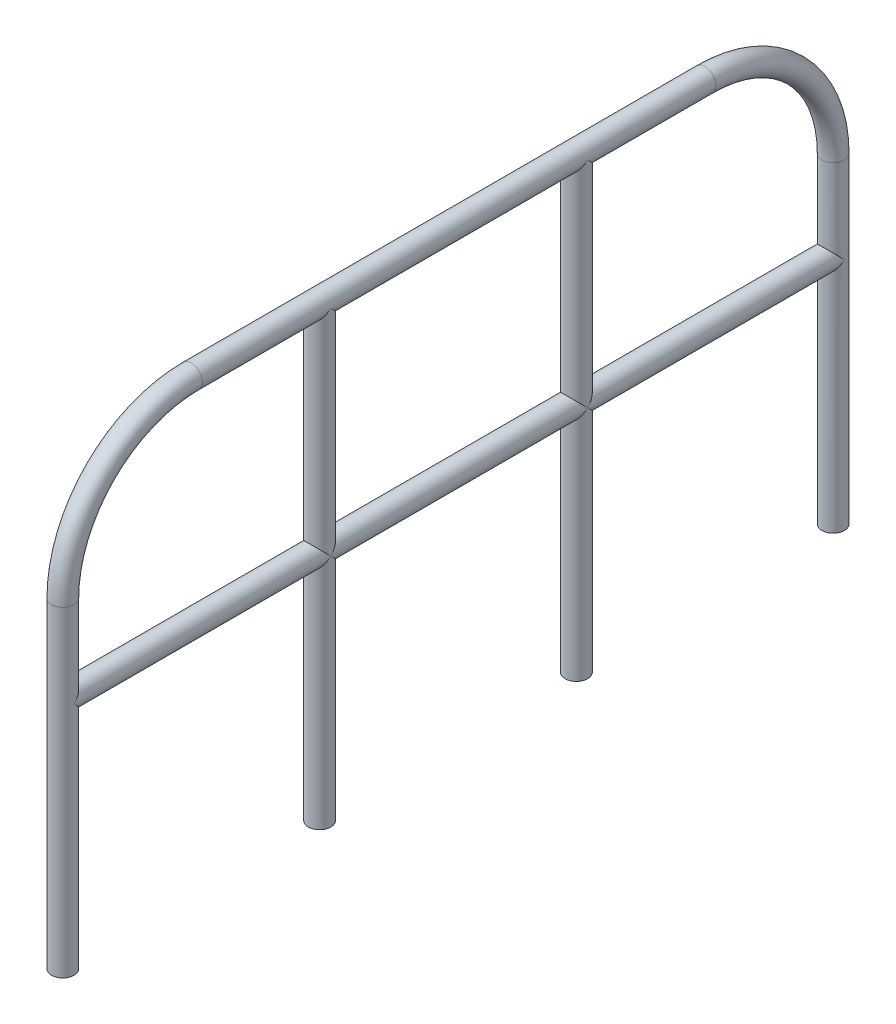
ISO-10303-21;
HEADER;
FILE_DESCRIPTION(('STEP AP214'),'2;1');
FILE_NAME('part.step','',(''),(''),'','','');
FILE_SCHEMA(('AUTOMOTIVE_DESIGN { 1 0 10303 214 1 1 1 1 }'));
ENDSEC;
DATA;
#1=APPLICATION_CONTEXT('core data for automotive mechanical design processes');
#2=APPLICATION_PROTOCOL_DEFINITION('international standard','automotive_design',2000,#1);
#3=PRODUCT_CONTEXT('',#1,'mechanical');
#4=PRODUCT('Part','Part','',(#3));
#5=PRODUCT_RELATED_PRODUCT_CATEGORY('part','',(#4));
#6=PRODUCT_DEFINITION_FORMATION('','',#4);
#7=PRODUCT_DEFINITION_CONTEXT('part definition',#1,'design');
#8=PRODUCT_DEFINITION('design','',#6,#7);
#9=PRODUCT_DEFINITION_SHAPE('','',#8);
#10=(LENGTH_UNIT() NAMED_UNIT(*) SI_UNIT(.MILLI.,.METRE.));
#11=(NAMED_UNIT(*) PLANE_ANGLE_UNIT() SI_UNIT($,.RADIAN.));
#12=(NAMED_UNIT(*) SI_UNIT($,.STERADIAN.) SOLID_ANGLE_UNIT());
#13=UNCERTAINTY_MEASURE_WITH_UNIT(LENGTH_MEASURE(1.E-05),#10,'distance_accuracy_value','');
#14=(GEOMETRIC_REPRESENTATION_CONTEXT(3) GLOBAL_UNCERTAINTY_ASSIGNED_CONTEXT((#13)) GLOBAL_UNIT_ASSIGNED_CONTEXT((#10,
#11,#12)) REPRESENTATION_CONTEXT('',''));
#15=CARTESIAN_POINT('',(0.,0.,0.));
#16=DIRECTION('',(0.,0.,1.));
#17=DIRECTION('',(1.,0.,0.));
#18=AXIS2_PLACEMENT_3D('',#15,#16,#17);
#19=CARTESIAN_POINT('',(-35.,10.,0.));
#20=DIRECTION('',(1.,0.,0.));
#21=DIRECTION('',(0.,0.,-1.));
#22=AXIS2_PLACEMENT_3D('',#19,#20,#21);
#23=PLANE('',#22);
#24=DIRECTION('',(0.,0.,1.));
#25=VECTOR('',#24,1.);
#26=CARTESIAN_POINT('',(-35.,0.,0.));
#27=LINE('',#26,#25);
#28=CARTESIAN_POINT('',(-35.,0.,-21.5581299689021));
#29=VERTEX_POINT('',#28);
#30=CARTESIAN_POINT('',(-35.,0.,0.));
#31=VERTEX_POINT('',#30);
#32=EDGE_CURVE('E107',#29,#31,#27,.T.);
#33=ORIENTED_EDGE('',*,*,#32,.F.);
#34=DIRECTION('',(0.,-1.,0.));
#35=VECTOR('',#34,1.);
#36=CARTESIAN_POINT('',(-35.,10.,-21.5581299689021));
#37=LINE('',#36,#35);
#38=CARTESIAN_POINT('',(-35.,10.,-21.5581299689021));
#39=VERTEX_POINT('',#38);
#40=EDGE_CURVE('E12',#39,#29,#37,.T.);
#41=ORIENTED_EDGE('',*,*,#40,.F.);
#42=DIRECTION('',(0.,0.,1.));
#43=VECTOR('',#42,1.);
#44=CARTESIAN_POINT('',(-35.,10.,0.));
#45=LINE('',#44,#43);
#46=CARTESIAN_POINT('',(-35.,10.,0.));
#47=VERTEX_POINT('',#46);
#48=EDGE_CURVE('E101',#39,#47,#45,.T.);
#49=ORIENTED_EDGE('',*,*,#48,.T.);
#50=DIRECTION('',(0.,-1.,0.));
#51=VECTOR('',#50,1.);
#52=CARTESIAN_POINT('',(-35.,10.,0.));
#53=LINE('',#52,#51);
#54=EDGE_CURVE('E46',#47,#31,#53,.T.);
#55=ORIENTED_EDGE('',*,*,#54,.T.);
#56=EDGE_LOOP('',(#33,#41,#49,#55));
#57=FACE_BOUND('',#56,.T.);
#58=ADVANCED_FACE('F43',(#57),#23,.T.);
#59=CARTESIAN_POINT('',(-35.,10.,-21.5581299689021));
#60=DIRECTION('',(0.,0.,-1.));
#61=DIRECTION('',(-1.,0.,0.));
#62=AXIS2_PLACEMENT_3D('',#59,#60,#61);
#63=PLANE('',#62);
#64=DIRECTION('',(1.,0.,0.));
#65=VECTOR('',#64,1.);
#66=CARTESIAN_POINT('',(-35.,0.,-21.5581299689021));
#67=LINE('',#66,#65);
#68=CARTESIAN_POINT('',(-43.2434008372538,0.,-21.5581299689021));
#69=VERTEX_POINT('',#68);
#70=EDGE_CURVE('E103',#69,#29,#67,.T.);
#71=ORIENTED_EDGE('',*,*,#70,.F.);
#72=DIRECTION('',(0.,-1.,0.));
#73=VECTOR('',#72,1.);
#74=CARTESIAN_POINT('',(-43.2434008372538,10.,-21.5581299689021));
#75=LINE('',#74,#73);
#76=CARTESIAN_POINT('',(-43.2434008372538,10.,-21.5581299689021));
#77=VERTEX_POINT('',#76);
#78=EDGE_CURVE('E52',#77,#69,#75,.T.);
#79=ORIENTED_EDGE('',*,*,#78,.F.);
#80=DIRECTION('',(1.,0.,0.));
#81=VECTOR('',#80,1.);
#82=CARTESIAN_POINT('',(-35.,10.,-21.5581299689021));
#83=LINE('',#82,#81);
#84=EDGE_CURVE('E98',#77,#39,#83,.T.);
#85=ORIENTED_EDGE('',*,*,#84,.T.);
#86=ORIENTED_EDGE('',*,*,#40,.T.);
#87=EDGE_LOOP('',(#71,#79,#85,#86));
#88=FACE_BOUND('',#87,.T.);
#89=ADVANCED_FACE('F117',(#88),#63,.T.);
#90=CARTESIAN_POINT('',(-43.2434008372538,10.,0.));
#91=DIRECTION('',(-1.,0.,0.));
#92=DIRECTION('',(0.,0.,1.));
#93=AXIS2_PLACEMENT_3D('',#90,#91,#92);
#94=PLANE('',#93);
#95=DIRECTION('',(0.,0.,-1.));
#96=VECTOR('',#95,1.);
#97=CARTESIAN_POINT('',(-43.2434008372538,0.,0.));
#98=LINE('',#97,#96);
#99=CARTESIAN_POINT('',(-43.2434008372538,0.,0.));
#100=VERTEX_POINT('',#99);
#101=EDGE_CURVE('E93',#100,#69,#98,.T.);
#102=ORIENTED_EDGE('',*,*,#101,.F.);
#103=DIRECTION('',(0.,-1.,0.));
#104=VECTOR('',#103,1.);
#105=CARTESIAN_POINT('',(-43.2434008372538,10.,0.));
#106=LINE('',#105,#104);
#107=CARTESIAN_POINT('',(-43.2434008372538,10.,0.));
#108=VERTEX_POINT('',#107);
#109=EDGE_CURVE('E88',#108,#100,#106,.T.);
#110=ORIENTED_EDGE('',*,*,#109,.F.);
#111=DIRECTION('',(0.,0.,-1.));
#112=VECTOR('',#111,1.);
#113=CARTESIAN_POINT('',(-43.2434008372538,10.,0.));
#114=LINE('',#113,#112);
#115=EDGE_CURVE('E91',#108,#77,#114,.T.);
#116=ORIENTED_EDGE('',*,*,#115,.T.);
#117=ORIENTED_EDGE('',*,*,#78,.T.);
#118=EDGE_LOOP('',(#102,#110,#116,#117));
#119=FACE_BOUND('',#118,.T.);
#120=ADVANCED_FACE('F90',(#119),#94,.T.);
#121=CARTESIAN_POINT('',(-35.,10.,0.));
#122=DIRECTION('',(0.,0.,1.));
#123=DIRECTION('',(1.,0.,0.));
#124=AXIS2_PLACEMENT_3D('',#121,#122,#123);
#125=PLANE('',#124);
#126=DIRECTION('',(-1.,0.,0.));
#127=VECTOR('',#126,1.);
#128=CARTESIAN_POINT('',(-35.,0.,0.));
#129=LINE('',#128,#127);
#130=EDGE_CURVE('E110',#31,#100,#129,.T.);
#131=ORIENTED_EDGE('',*,*,#130,.F.);
#132=ORIENTED_EDGE('',*,*,#54,.F.);
#133=DIRECTION('',(-1.,0.,0.));
#134=VECTOR('',#133,1.);
#135=CARTESIAN_POINT('',(-35.,10.,0.));
#136=LINE('',#135,#134);
#137=EDGE_CURVE('E97',#47,#108,#136,.T.);
#138=ORIENTED_EDGE('',*,*,#137,.T.);
#139=ORIENTED_EDGE('',*,*,#109,.T.);
#140=EDGE_LOOP('',(#131,#132,#138,#139));
#141=FACE_BOUND('',#140,.T.);
#142=ADVANCED_FACE('F100',(#141),#125,.T.);
#143=CARTESIAN_POINT('',(0.,10.,0.));
#144=DIRECTION('',(0.,1.,0.));
#145=DIRECTION('',(0.,0.,1.));
#146=AXIS2_PLACEMENT_3D('',#143,#144,#145);
#147=PLANE('',#146);
#148=ORIENTED_EDGE('',*,*,#48,.F.);
#149=ORIENTED_EDGE('',*,*,#84,.F.);
#150=ORIENTED_EDGE('',*,*,#115,.F.);
#151=ORIENTED_EDGE('',*,*,#137,.F.);
#152=EDGE_LOOP('',(#148,#149,#150,#151));
#153=FACE_BOUND('',#152,.T.);
#154=ADVANCED_FACE('F96',(#153),#147,.T.);
#155=CARTESIAN_POINT('',(0.,0.,0.));
#156=DIRECTION('',(0.,1.,0.));
#157=DIRECTION('',(0.,0.,1.));
#158=AXIS2_PLACEMENT_3D('',#155,#156,#157);
#159=PLANE('',#158);
#160=ORIENTED_EDGE('',*,*,#32,.T.);
#161=ORIENTED_EDGE('',*,*,#130,.T.);
#162=ORIENTED_EDGE('',*,*,#101,.T.);
#163=ORIENTED_EDGE('',*,*,#70,.T.);
#164=EDGE_LOOP('',(#160,#161,#162,#163));
#165=FACE_BOUND('',#164,.T.);
#166=ADVANCED_FACE('F116',(#165),#159,.F.);
#167=CLOSED_SHELL('',(#58,#89,#120,#142,#154,#166));
#168=MANIFOLD_SOLID_BREP('B2',#167);
#169=CARTESIAN_POINT('',(0.,1400.,-1600.));
#170=DIRECTION('',(0.,-1.,0.));
#171=DIRECTION('',(0.,0.,-1.));
#172=AXIS2_PLACEMENT_3D('',#169,#170,#171);
#173=CYLINDRICAL_SURFACE('',#172,35.);
#174=CARTESIAN_POINT('',(0.,1400.,-1600.));
#175=DIRECTION('',(0.,-0.707106781186547,-0.707106781186547));
#176=DIRECTION('',(0.,0.707106781186547,-0.707106781186547));
#177=AXIS2_PLACEMENT_3D('',#174,#175,#176);
#178=ELLIPSE('',#177,49.4974746830583,35.);
#179=CARTESIAN_POINT('',(-35.,1400.,-1600.));
#180=VERTEX_POINT('',#179);
#181=CARTESIAN_POINT('',(35.,1400.,-1600.));
#182=VERTEX_POINT('',#181);
#183=EDGE_CURVE('E262',#180,#182,#178,.F.);
#184=ORIENTED_EDGE('',*,*,#183,.F.);
#185=CARTESIAN_POINT('',(0.,1400.,-1600.));
#186=DIRECTION('',(0.,0.707106781186547,-0.707106781186547));
#187=DIRECTION('',(0.,-0.707106781186547,-0.707106781186547));
#188=AXIS2_PLACEMENT_3D('',#185,#186,#187);
#189=ELLIPSE('',#188,49.4974746830583,35.);
#190=EDGE_CURVE('E259',#182,#180,#189,.T.);
#191=ORIENTED_EDGE('',*,*,#190,.F.);
#192=EDGE_LOOP('',(#184,#191));
#193=FACE_BOUND('',#192,.T.);
#194=CARTESIAN_POINT('',(0.,731.105097609489,-1600.));
#195=DIRECTION('',(0.,-0.707106781186547,-0.707106781186547));
#196=DIRECTION('',(0.,-0.707106781186547,0.707106781186547));
#197=AXIS2_PLACEMENT_3D('',#194,#195,#196);
#198=ELLIPSE('',#197,49.4974746830583,35.);
#199=CARTESIAN_POINT('',(35.,731.105097609489,-1600.));
#200=VERTEX_POINT('',#199);
#201=CARTESIAN_POINT('',(-35.,731.105097609489,-1600.));
#202=VERTEX_POINT('',#201);
#203=EDGE_CURVE('E181',#200,#202,#198,.F.);
#204=ORIENTED_EDGE('',*,*,#203,.T.);
#205=CARTESIAN_POINT('',(0.,731.105097609489,-1600.));
#206=DIRECTION('',(0.,-0.707106781186547,0.707106781186547));
#207=DIRECTION('',(0.,-0.707106781186547,-0.707106781186547));
#208=AXIS2_PLACEMENT_3D('',#205,#206,#207);
#209=ELLIPSE('',#208,49.4974746830583,35.);
#210=EDGE_CURVE('E441',#202,#200,#209,.F.);
#211=ORIENTED_EDGE('',*,*,#210,.T.);
#212=EDGE_LOOP('',(#204,#211));
#213=FACE_BOUND('',#212,.T.);
#214=ADVANCED_FACE('F167',(#193,#213),#173,.T.);
#215=CARTESIAN_POINT('',(0.,1400.,-800.));
#216=DIRECTION('',(0.,-1.,0.));
#217=DIRECTION('',(0.,0.,-1.));
#218=AXIS2_PLACEMENT_3D('',#215,#216,#217);
#219=CYLINDRICAL_SURFACE('',#218,35.);
#220=CARTESIAN_POINT('',(0.,1400.,-800.));
#221=DIRECTION('',(0.,-0.707106781186547,-0.707106781186547));
#222=DIRECTION('',(0.,0.707106781186547,-0.707106781186547));
#223=AXIS2_PLACEMENT_3D('',#220,#221,#222);
#224=ELLIPSE('',#223,49.4974746830583,35.);
#225=CARTESIAN_POINT('',(-35.,1400.,-800.));
#226=VERTEX_POINT('',#225);
#227=CARTESIAN_POINT('',(35.,1400.,-800.));
#228=VERTEX_POINT('',#227);
#229=EDGE_CURVE('E268',#226,#228,#224,.F.);
#230=ORIENTED_EDGE('',*,*,#229,.F.);
#231=CARTESIAN_POINT('',(0.,1400.,-800.));
#232=DIRECTION('',(0.,0.707106781186547,-0.707106781186547));
#233=DIRECTION('',(0.,-0.707106781186547,-0.707106781186547));
#234=AXIS2_PLACEMENT_3D('',#231,#232,#233);
#235=ELLIPSE('',#234,49.4974746830583,35.);
#236=EDGE_CURVE('E265',#228,#226,#235,.T.);
#237=ORIENTED_EDGE('',*,*,#236,.F.);
#238=EDGE_LOOP('',(#230,#237));
#239=FACE_BOUND('',#238,.T.);
#240=CARTESIAN_POINT('',(0.,731.105097609489,-800.));
#241=DIRECTION('',(0.,-0.707106781186547,-0.707106781186547));
#242=DIRECTION('',(0.,-0.707106781186547,0.707106781186547));
#243=AXIS2_PLACEMENT_3D('',#240,#241,#242);
#244=ELLIPSE('',#243,49.4974746830583,35.);
#245=CARTESIAN_POINT('',(35.,731.105097609489,-800.));
#246=VERTEX_POINT('',#245);
#247=CARTESIAN_POINT('',(-35.,731.105097609489,-800.));
#248=VERTEX_POINT('',#247);
#249=EDGE_CURVE('E187',#246,#248,#244,.F.);
#250=ORIENTED_EDGE('',*,*,#249,.T.);
#251=CARTESIAN_POINT('',(0.,731.105097609489,-800.));
#252=DIRECTION('',(0.,-0.707106781186547,0.707106781186547));
#253=DIRECTION('',(0.,-0.707106781186547,-0.707106781186547));
#254=AXIS2_PLACEMENT_3D('',#251,#252,#253);
#255=ELLIPSE('',#254,49.4974746830583,35.);
#256=EDGE_CURVE('E41',#248,#246,#255,.F.);
#257=ORIENTED_EDGE('',*,*,#256,.T.);
#258=EDGE_LOOP('',(#250,#257));
#259=FACE_BOUND('',#258,.T.);
#260=ADVANCED_FACE('F285',(#239,#259),#219,.T.);
#261=CARTESIAN_POINT('',(0.,1400.,-400.000000000003));
#262=DIRECTION('',(0.,0.,-1.));
#263=DIRECTION('',(-1.,0.,0.));
#264=AXIS2_PLACEMENT_3D('',#261,#262,#263);
#265=CYLINDRICAL_SURFACE('',#264,35.);
#266=ORIENTED_EDGE('',*,*,#190,.T.);
#267=ORIENTED_EDGE('',*,*,#183,.T.);
#268=EDGE_LOOP('',(#266,#267));
#269=FACE_BOUND('',#268,.T.);
#270=CARTESIAN_POINT('',(0.,1400.,-400.000000000003));
#271=DIRECTION('',(0.,0.,-1.));
#272=DIRECTION('',(0.,1.,0.));
#273=AXIS2_PLACEMENT_3D('',#270,#271,#272);
#274=CIRCLE('',#273,35.);
#275=CARTESIAN_POINT('',(0.,1435.,-400.000000000003));
#276=VERTEX_POINT('',#275);
#277=EDGE_CURVE('E245',#276,#276,#274,.T.);
#278=ORIENTED_EDGE('',*,*,#277,.T.);
#279=EDGE_LOOP('',(#278));
#280=FACE_BOUND('',#279,.T.);
#281=CARTESIAN_POINT('',(0.,1400.,-2000.));
#282=DIRECTION('',(0.,0.,-1.));
#283=DIRECTION('',(0.,1.,0.));
#284=AXIS2_PLACEMENT_3D('',#281,#282,#283);
#285=CIRCLE('',#284,35.);
#286=CARTESIAN_POINT('',(0.,1435.,-2000.));
#287=VERTEX_POINT('',#286);
#288=EDGE_CURVE('E250',#287,#287,#285,.T.);
#289=ORIENTED_EDGE('',*,*,#288,.F.);
#290=EDGE_LOOP('',(#289));
#291=FACE_BOUND('',#290,.T.);
#292=ORIENTED_EDGE('',*,*,#236,.T.);
#293=ORIENTED_EDGE('',*,*,#229,.T.);
#294=EDGE_LOOP('',(#292,#293));
#295=FACE_BOUND('',#294,.T.);
#296=ADVANCED_FACE('F287',(#269,#280,#291,#295),#265,.T.);
#297=CARTESIAN_POINT('',(0.,999.999999999997,-2400.));
#298=DIRECTION('',(0.,-1.,0.));
#299=DIRECTION('',(0.,0.,-1.));
#300=AXIS2_PLACEMENT_3D('',#297,#298,#299);
#301=CYLINDRICAL_SURFACE('',#300,35.);
#302=CARTESIAN_POINT('',(0.,731.105097609489,-2400.));
#303=DIRECTION('',(0.,-0.707106781186547,0.707106781186547));
#304=DIRECTION('',(0.,-0.707106781186547,-0.707106781186547));
#305=AXIS2_PLACEMENT_3D('',#302,#303,#304);
#306=ELLIPSE('',#305,49.4974746830583,35.);
#307=CARTESIAN_POINT('',(35.,731.105097609489,-2400.));
#308=VERTEX_POINT('',#307);
#309=CARTESIAN_POINT('',(-35.,731.105097609489,-2400.));
#310=VERTEX_POINT('',#309);
#311=EDGE_CURVE('E220',#308,#310,#306,.T.);
#312=ORIENTED_EDGE('',*,*,#311,.F.);
#313=CARTESIAN_POINT('',(0.,731.105097609489,-2400.));
#314=DIRECTION('',(0.,-0.707106781186547,-0.707106781186547));
#315=DIRECTION('',(0.,-0.707106781186547,0.707106781186547));
#316=AXIS2_PLACEMENT_3D('',#313,#314,#315);
#317=ELLIPSE('',#316,49.4974746830583,35.);
#318=EDGE_CURVE('E223',#310,#308,#317,.F.);
#319=ORIENTED_EDGE('',*,*,#318,.F.);
#320=EDGE_LOOP('',(#312,#319));
#321=FACE_BOUND('',#320,.T.);
#322=CARTESIAN_POINT('',(0.,999.999999999997,-2400.));
#323=DIRECTION('',(0.,-1.,0.));
#324=DIRECTION('',(0.,0.,-1.));
#325=AXIS2_PLACEMENT_3D('',#322,#323,#324);
#326=CIRCLE('',#325,35.);
#327=CARTESIAN_POINT('',(0.,999.999999999997,-2435.));
#328=VERTEX_POINT('',#327);
#329=EDGE_CURVE('E253',#328,#328,#326,.T.);
#330=ORIENTED_EDGE('',*,*,#329,.T.);
#331=EDGE_LOOP('',(#330));
#332=FACE_BOUND('',#331,.T.);
#333=CARTESIAN_POINT('',(0.,-1.11022302462516E-13,-2400.));
#334=DIRECTION('',(0.,-1.,0.));
#335=DIRECTION('',(0.,0.,-1.));
#336=AXIS2_PLACEMENT_3D('',#333,#334,#335);
#337=CIRCLE('',#336,35.);
#338=CARTESIAN_POINT('',(0.,-1.10149586872964E-12,-2435.));
#339=VERTEX_POINT('',#338);
#340=EDGE_CURVE('E256',#339,#339,#337,.T.);
#341=ORIENTED_EDGE('',*,*,#340,.F.);
#342=EDGE_LOOP('',(#341));
#343=FACE_BOUND('',#342,.T.);
#344=ADVANCED_FACE('F169',(#321,#332,#343),#301,.T.);
#345=CARTESIAN_POINT('',(0.,1000.,-2000.));
#346=DIRECTION('',(-1.,0.,0.));
#347=DIRECTION('',(0.,0.,1.));
#348=AXIS2_PLACEMENT_3D('',#345,#346,#347);
#349=TOROIDAL_SURFACE('',#348,400.,35.);
#350=CARTESIAN_POINT('',(0.,1000.,-2000.));
#351=DIRECTION('',(-1.,0.,0.));
#352=DIRECTION('',(0.,0.,1.));
#353=AXIS2_PLACEMENT_3D('',#350,#351,#352);
#354=CIRCLE('',#353,435.);
#355=EDGE_CURVE('',#287,#328,#354,.T.);
#356=ORIENTED_EDGE('',*,*,#288,.T.);
#357=ORIENTED_EDGE('',*,*,#329,.F.);
#358=ORIENTED_EDGE('',*,*,#355,.T.);
#359=ORIENTED_EDGE('',*,*,#355,.F.);
#360=EDGE_LOOP('',(#356,#358,#357,#359));
#361=FACE_BOUND('',#360,.T.);
#362=ADVANCED_FACE('F341',(#361),#349,.T.);
#363=CARTESIAN_POINT('',(0.,1000.,-400.));
#364=DIRECTION('',(-1.,0.,0.));
#365=DIRECTION('',(0.,0.,1.));
#366=AXIS2_PLACEMENT_3D('',#363,#364,#365);
#367=TOROIDAL_SURFACE('',#366,400.,35.);
#368=CARTESIAN_POINT('',(0.,999.999999999997,0.));
#369=DIRECTION('',(0.,1.,0.));
#370=DIRECTION('',(0.,0.,1.));
#371=AXIS2_PLACEMENT_3D('',#368,#369,#370);
#372=CIRCLE('',#371,35.);
#373=CARTESIAN_POINT('',(0.,999.999999999997,35.));
#374=VERTEX_POINT('',#373);
#375=EDGE_CURVE('E242',#374,#374,#372,.T.);
#376=CARTESIAN_POINT('',(0.,1000.,-400.));
#377=DIRECTION('',(-1.,0.,0.));
#378=DIRECTION('',(0.,0.,1.));
#379=AXIS2_PLACEMENT_3D('',#376,#377,#378);
#380=CIRCLE('',#379,435.);
#381=EDGE_CURVE('',#374,#276,#380,.T.);
#382=ORIENTED_EDGE('',*,*,#375,.T.);
#383=ORIENTED_EDGE('',*,*,#277,.F.);
#384=ORIENTED_EDGE('',*,*,#381,.T.);
#385=ORIENTED_EDGE('',*,*,#381,.F.);
#386=EDGE_LOOP('',(#382,#384,#383,#385));
#387=FACE_BOUND('',#386,.T.);
#388=ADVANCED_FACE('F338',(#387),#367,.T.);
#389=CARTESIAN_POINT('',(0.,999.999999999997,0.));
#390=DIRECTION('',(0.,-1.,0.));
#391=DIRECTION('',(0.,0.,-1.));
#392=AXIS2_PLACEMENT_3D('',#389,#390,#391);
#393=CYLINDRICAL_SURFACE('',#392,35.);
#394=CARTESIAN_POINT('',(0.,0.,0.));
#395=DIRECTION('',(0.,1.,0.));
#396=DIRECTION('',(0.,0.,1.));
#397=AXIS2_PLACEMENT_3D('',#394,#395,#396);
#398=CIRCLE('',#397,35.);
#399=CARTESIAN_POINT('',(0.,0.,35.));
#400=VERTEX_POINT('',#399);
#401=EDGE_CURVE('E241',#400,#400,#398,.T.);
#402=ORIENTED_EDGE('',*,*,#401,.T.);
#403=EDGE_LOOP('',(#402));
#404=FACE_BOUND('',#403,.T.);
#405=CARTESIAN_POINT('',(0.,731.105097609489,0.));
#406=DIRECTION('',(0.,-0.707106781186547,-0.707106781186547));
#407=DIRECTION('',(0.,-0.707106781186547,0.707106781186547));
#408=AXIS2_PLACEMENT_3D('',#405,#406,#407);
#409=ELLIPSE('',#408,49.4974746830583,35.);
#410=CARTESIAN_POINT('',(35.,731.105097609489,0.));
#411=VERTEX_POINT('',#410);
#412=CARTESIAN_POINT('',(-35.,731.105097609489,0.));
#413=VERTEX_POINT('',#412);
#414=EDGE_CURVE('E232',#411,#413,#409,.F.);
#415=ORIENTED_EDGE('',*,*,#414,.T.);
#416=CARTESIAN_POINT('',(0.,731.105097609489,0.));
#417=DIRECTION('',(0.,-0.707106781186547,0.707106781186547));
#418=DIRECTION('',(0.,-0.707106781186547,-0.707106781186547));
#419=AXIS2_PLACEMENT_3D('',#416,#417,#418);
#420=ELLIPSE('',#419,49.4974746830583,35.);
#421=EDGE_CURVE('E229',#413,#411,#420,.T.);
#422=ORIENTED_EDGE('',*,*,#421,.T.);
#423=EDGE_LOOP('',(#415,#422));
#424=FACE_BOUND('',#423,.T.);
#425=ORIENTED_EDGE('',*,*,#375,.F.);
#426=EDGE_LOOP('',(#425));
#427=FACE_BOUND('',#426,.T.);
#428=ADVANCED_FACE('F333',(#404,#424,#427),#393,.T.);
#429=CARTESIAN_POINT('',(0.,-1.11022302462516E-13,-2400.));
#430=DIRECTION('',(0.,-1.,0.));
#431=DIRECTION('',(0.,0.,-1.));
#432=AXIS2_PLACEMENT_3D('',#429,#430,#431);
#433=PLANE('',#432);
#434=ORIENTED_EDGE('',*,*,#340,.T.);
#435=EDGE_LOOP('',(#434));
#436=FACE_BOUND('',#435,.T.);
#437=ADVANCED_FACE('F317',(#436),#433,.T.);
#438=CARTESIAN_POINT('',(0.,0.,0.));
#439=DIRECTION('',(0.,1.,0.));
#440=DIRECTION('',(0.,0.,1.));
#441=AXIS2_PLACEMENT_3D('',#438,#439,#440);
#442=PLANE('',#441);
#443=ORIENTED_EDGE('',*,*,#401,.F.);
#444=EDGE_LOOP('',(#443));
#445=FACE_BOUND('',#444,.T.);
#446=ADVANCED_FACE('F312',(#445),#442,.F.);
#447=CARTESIAN_POINT('',(0.,731.105097609489,-2400.));
#448=DIRECTION('',(0.,0.,1.));
#449=DIRECTION('',(1.,0.,0.));
#450=AXIS2_PLACEMENT_3D('',#447,#448,#449);
#451=CYLINDRICAL_SURFACE('',#450,35.);
#452=CARTESIAN_POINT('',(0.,731.105097609489,-800.));
#453=DIRECTION('',(0.,-0.707106781186547,0.707106781186547));
#454=DIRECTION('',(0.,-0.707106781186547,-0.707106781186547));
#455=AXIS2_PLACEMENT_3D('',#452,#453,#454);
#456=ELLIPSE('',#455,49.4974746830583,35.);
#457=EDGE_CURVE('E175',#248,#246,#456,.T.);
#458=ORIENTED_EDGE('',*,*,#457,.F.);
#459=ORIENTED_EDGE('',*,*,#249,.F.);
#460=EDGE_LOOP('',(#458,#459));
#461=FACE_BOUND('',#460,.T.);
#462=ORIENTED_EDGE('',*,*,#210,.F.);
#463=CARTESIAN_POINT('',(0.,731.105097609489,-1600.));
#464=DIRECTION('',(0.,-0.707106781186547,-0.707106781186547));
#465=DIRECTION('',(0.,-0.707106781186547,0.707106781186547));
#466=AXIS2_PLACEMENT_3D('',#463,#464,#465);
#467=ELLIPSE('',#466,49.4974746830583,35.);
#468=EDGE_CURVE('E447',#200,#202,#467,.T.);
#469=ORIENTED_EDGE('',*,*,#468,.F.);
#470=EDGE_LOOP('',(#462,#469));
#471=FACE_BOUND('',#470,.T.);
#472=ADVANCED_FACE('F280',(#461,#471),#451,.T.);
#473=CARTESIAN_POINT('',(0.,0.,-800.));
#474=DIRECTION('',(0.,1.,0.));
#475=DIRECTION('',(0.,0.,1.));
#476=AXIS2_PLACEMENT_3D('',#473,#474,#475);
#477=PLANE('',#476);
#478=CARTESIAN_POINT('',(0.,0.,-800.));
#479=DIRECTION('',(0.,1.,0.));
#480=DIRECTION('',(0.,0.,1.));
#481=AXIS2_PLACEMENT_3D('',#478,#479,#480);
#482=CIRCLE('',#481,35.);
#483=CARTESIAN_POINT('',(0.,0.,-765.));
#484=VERTEX_POINT('',#483);
#485=EDGE_CURVE('E225',#484,#484,#482,.T.);
#486=ORIENTED_EDGE('',*,*,#485,.F.);
#487=EDGE_LOOP('',(#486));
#488=FACE_BOUND('',#487,.T.);
#489=ADVANCED_FACE('F302',(#488),#477,.F.);
#490=CARTESIAN_POINT('',(0.,731.105097609489,-800.));
#491=DIRECTION('',(0.,-0.707106781186547,-0.707106781186547));
#492=DIRECTION('',(0.,-0.707106781186547,0.707106781186547));
#493=AXIS2_PLACEMENT_3D('',#490,#491,#492);
#494=ELLIPSE('',#493,49.4974746830583,35.);
#495=EDGE_CURVE('E272',#246,#248,#494,.T.);
#496=ORIENTED_EDGE('',*,*,#495,.T.);
#497=ORIENTED_EDGE('',*,*,#457,.T.);
#498=EDGE_LOOP('',(#496,#497));
#499=FACE_BOUND('',#498,.T.);
#500=ORIENTED_EDGE('',*,*,#485,.T.);
#501=EDGE_LOOP('',(#500));
#502=FACE_BOUND('',#501,.T.);
#503=ADVANCED_FACE('F276',(#499,#502),#219,.T.);
#504=ORIENTED_EDGE('',*,*,#256,.F.);
#505=ORIENTED_EDGE('',*,*,#495,.F.);
#506=EDGE_LOOP('',(#504,#505));
#507=FACE_BOUND('',#506,.T.);
#508=ORIENTED_EDGE('',*,*,#421,.F.);
#509=ORIENTED_EDGE('',*,*,#414,.F.);
#510=EDGE_LOOP('',(#508,#509));
#511=FACE_BOUND('',#510,.T.);
#512=ADVANCED_FACE('F283',(#507,#511),#451,.T.);
#513=ORIENTED_EDGE('',*,*,#318,.T.);
#514=ORIENTED_EDGE('',*,*,#311,.T.);
#515=EDGE_LOOP('',(#513,#514));
#516=FACE_BOUND('',#515,.T.);
#517=CARTESIAN_POINT('',(0.,731.105097609489,-1600.));
#518=DIRECTION('',(0.,-0.707106781186547,0.707106781186547));
#519=DIRECTION('',(0.,-0.707106781186547,-0.707106781186547));
#520=AXIS2_PLACEMENT_3D('',#517,#518,#519);
#521=ELLIPSE('',#520,49.4974746830583,35.);
#522=EDGE_CURVE('E442',#202,#200,#521,.T.);
#523=ORIENTED_EDGE('',*,*,#522,.F.);
#524=ORIENTED_EDGE('',*,*,#203,.F.);
#525=EDGE_LOOP('',(#523,#524));
#526=FACE_BOUND('',#525,.T.);
#527=ADVANCED_FACE('F227',(#516,#526),#451,.T.);
#528=CARTESIAN_POINT('',(0.,0.,-1600.));
#529=DIRECTION('',(0.,1.,0.));
#530=DIRECTION('',(0.,0.,1.));
#531=AXIS2_PLACEMENT_3D('',#528,#529,#530);
#532=PLANE('',#531);
#533=CARTESIAN_POINT('',(0.,0.,-1600.));
#534=DIRECTION('',(0.,1.,0.));
#535=DIRECTION('',(0.,0.,1.));
#536=AXIS2_PLACEMENT_3D('',#533,#534,#535);
#537=CIRCLE('',#536,35.);
#538=CARTESIAN_POINT('',(0.,0.,-1565.));
#539=VERTEX_POINT('',#538);
#540=EDGE_CURVE('E238',#539,#539,#537,.T.);
#541=ORIENTED_EDGE('',*,*,#540,.F.);
#542=EDGE_LOOP('',(#541));
#543=FACE_BOUND('',#542,.T.);
#544=ADVANCED_FACE('F321',(#543),#532,.F.);
#545=ORIENTED_EDGE('',*,*,#468,.T.);
#546=ORIENTED_EDGE('',*,*,#522,.T.);
#547=EDGE_LOOP('',(#545,#546));
#548=FACE_BOUND('',#547,.T.);
#549=ORIENTED_EDGE('',*,*,#540,.T.);
#550=EDGE_LOOP('',(#549));
#551=FACE_BOUND('',#550,.T.);
#552=ADVANCED_FACE('F298',(#548,#551),#173,.T.);
#553=CLOSED_SHELL('',(#214,#260,#296,#344,#362,#388,#428,#437,#446,#472,#489,#503,#512,#527,
#544,#552));
#554=MANIFOLD_SOLID_BREP('B6',#553);
#555=ADVANCED_BREP_SHAPE_REPRESENTATION('',(#18,#168,#554),#14);
#556=SHAPE_DEFINITION_REPRESENTATION(#9,#555);
ENDSEC;
END-ISO-10303-21;
